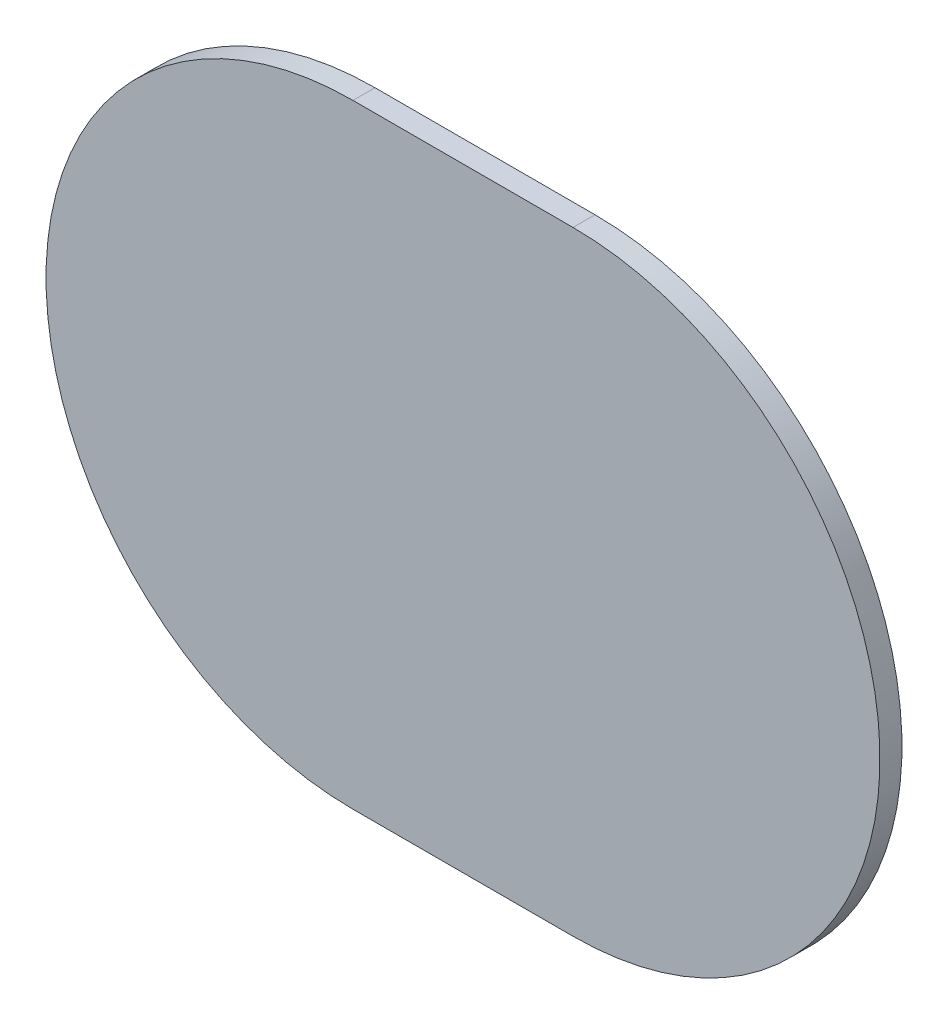
ISO-10303-21;
HEADER;
FILE_DESCRIPTION(('STEP AP214'),'2;1');
FILE_NAME('part.step','',(''),(''),'','','');
FILE_SCHEMA(('AUTOMOTIVE_DESIGN { 1 0 10303 214 1 1 1 1 }'));
ENDSEC;
DATA;
#1=APPLICATION_CONTEXT('core data for automotive mechanical design processes');
#2=APPLICATION_PROTOCOL_DEFINITION('international standard','automotive_design',2000,#1);
#3=PRODUCT_CONTEXT('',#1,'mechanical');
#4=PRODUCT('Part','Part','',(#3));
#5=PRODUCT_RELATED_PRODUCT_CATEGORY('part','',(#4));
#6=PRODUCT_DEFINITION_FORMATION('','',#4);
#7=PRODUCT_DEFINITION_CONTEXT('part definition',#1,'design');
#8=PRODUCT_DEFINITION('design','',#6,#7);
#9=PRODUCT_DEFINITION_SHAPE('','',#8);
#10=(LENGTH_UNIT() NAMED_UNIT(*) SI_UNIT(.MILLI.,.METRE.));
#11=(NAMED_UNIT(*) PLANE_ANGLE_UNIT() SI_UNIT($,.RADIAN.));
#12=(NAMED_UNIT(*) SI_UNIT($,.STERADIAN.) SOLID_ANGLE_UNIT());
#13=UNCERTAINTY_MEASURE_WITH_UNIT(LENGTH_MEASURE(1.E-05),#10,'distance_accuracy_value','');
#14=(GEOMETRIC_REPRESENTATION_CONTEXT(3) GLOBAL_UNCERTAINTY_ASSIGNED_CONTEXT((#13)) GLOBAL_UNIT_ASSIGNED_CONTEXT((#10,
#11,#12)) REPRESENTATION_CONTEXT('',''));
#15=CARTESIAN_POINT('',(0.,0.,0.));
#16=DIRECTION('',(0.,0.,1.));
#17=DIRECTION('',(1.,0.,0.));
#18=AXIS2_PLACEMENT_3D('',#15,#16,#17);
#19=CARTESIAN_POINT('',(-20.,-27.9,2.));
#20=DIRECTION('',(0.,1.,0.));
#21=DIRECTION('',(0.,0.,1.));
#22=AXIS2_PLACEMENT_3D('',#19,#20,#21);
#23=PLANE('',#22);
#24=DIRECTION('',(1.,0.,0.));
#25=VECTOR('',#24,1.);
#26=CARTESIAN_POINT('',(-20.,-27.9,0.));
#27=LINE('',#26,#25);
#28=CARTESIAN_POINT('',(-20.,-27.9,0.));
#29=VERTEX_POINT('',#28);
#30=CARTESIAN_POINT('',(0.,-27.9,0.));
#31=VERTEX_POINT('',#30);
#32=EDGE_CURVE('E102',#29,#31,#27,.T.);
#33=ORIENTED_EDGE('',*,*,#32,.T.);
#34=DIRECTION('',(0.,0.,-1.));
#35=VECTOR('',#34,1.);
#36=CARTESIAN_POINT('',(0.,-27.9,2.));
#37=LINE('',#36,#35);
#38=CARTESIAN_POINT('',(0.,-27.9,2.));
#39=VERTEX_POINT('',#38);
#40=EDGE_CURVE('E11',#39,#31,#37,.T.);
#41=ORIENTED_EDGE('',*,*,#40,.F.);
#42=DIRECTION('',(1.,0.,0.));
#43=VECTOR('',#42,1.);
#44=CARTESIAN_POINT('',(-20.,-27.9,2.));
#45=LINE('',#44,#43);
#46=CARTESIAN_POINT('',(-20.,-27.9,2.));
#47=VERTEX_POINT('',#46);
#48=EDGE_CURVE('E90',#47,#39,#45,.T.);
#49=ORIENTED_EDGE('',*,*,#48,.F.);
#50=DIRECTION('',(0.,0.,-1.));
#51=VECTOR('',#50,1.);
#52=CARTESIAN_POINT('',(-20.,-27.9,2.));
#53=LINE('',#52,#51);
#54=EDGE_CURVE('E98',#47,#29,#53,.T.);
#55=ORIENTED_EDGE('',*,*,#54,.T.);
#56=EDGE_LOOP('',(#33,#41,#49,#55));
#57=FACE_BOUND('',#56,.T.);
#58=ADVANCED_FACE('F39',(#57),#23,.F.);
#59=CARTESIAN_POINT('',(0.,0.,2.));
#60=DIRECTION('',(0.,0.,-1.));
#61=DIRECTION('',(-1.,0.,0.));
#62=AXIS2_PLACEMENT_3D('',#59,#60,#61);
#63=CYLINDRICAL_SURFACE('',#62,27.9);
#64=CARTESIAN_POINT('',(0.,0.,0.));
#65=DIRECTION('',(0.,0.,1.));
#66=DIRECTION('',(1.,0.,0.));
#67=AXIS2_PLACEMENT_3D('',#64,#65,#66);
#68=CIRCLE('',#67,27.9);
#69=CARTESIAN_POINT('',(0.,27.9,0.));
#70=VERTEX_POINT('',#69);
#71=EDGE_CURVE('E94',#31,#70,#68,.T.);
#72=ORIENTED_EDGE('',*,*,#71,.T.);
#73=DIRECTION('',(0.,0.,-1.));
#74=VECTOR('',#73,1.);
#75=CARTESIAN_POINT('',(0.,27.9,2.));
#76=LINE('',#75,#74);
#77=CARTESIAN_POINT('',(0.,27.9,2.));
#78=VERTEX_POINT('',#77);
#79=EDGE_CURVE('E47',#78,#70,#76,.T.);
#80=ORIENTED_EDGE('',*,*,#79,.F.);
#81=CARTESIAN_POINT('',(0.,0.,2.));
#82=DIRECTION('',(0.,0.,1.));
#83=DIRECTION('',(1.,0.,0.));
#84=AXIS2_PLACEMENT_3D('',#81,#82,#83);
#85=CIRCLE('',#84,27.9);
#86=EDGE_CURVE('E85',#39,#78,#85,.T.);
#87=ORIENTED_EDGE('',*,*,#86,.F.);
#88=ORIENTED_EDGE('',*,*,#40,.T.);
#89=EDGE_LOOP('',(#72,#80,#87,#88));
#90=FACE_BOUND('',#89,.T.);
#91=ADVANCED_FACE('F93',(#90),#63,.T.);
#92=CARTESIAN_POINT('',(0.,27.9,2.));
#93=DIRECTION('',(0.,-1.,0.));
#94=DIRECTION('',(0.,0.,-1.));
#95=AXIS2_PLACEMENT_3D('',#92,#93,#94);
#96=PLANE('',#95);
#97=DIRECTION('',(-1.,0.,0.));
#98=VECTOR('',#97,1.);
#99=CARTESIAN_POINT('',(0.,27.9,0.));
#100=LINE('',#99,#98);
#101=CARTESIAN_POINT('',(-20.,27.9,0.));
#102=VERTEX_POINT('',#101);
#103=EDGE_CURVE('E72',#70,#102,#100,.T.);
#104=ORIENTED_EDGE('',*,*,#103,.T.);
#105=DIRECTION('',(0.,0.,-1.));
#106=VECTOR('',#105,1.);
#107=CARTESIAN_POINT('',(-20.,27.9,2.));
#108=LINE('',#107,#106);
#109=CARTESIAN_POINT('',(-20.,27.9,2.));
#110=VERTEX_POINT('',#109);
#111=EDGE_CURVE('E95',#110,#102,#108,.T.);
#112=ORIENTED_EDGE('',*,*,#111,.F.);
#113=DIRECTION('',(-1.,0.,0.));
#114=VECTOR('',#113,1.);
#115=CARTESIAN_POINT('',(0.,27.9,2.));
#116=LINE('',#115,#114);
#117=EDGE_CURVE('E88',#78,#110,#116,.T.);
#118=ORIENTED_EDGE('',*,*,#117,.F.);
#119=ORIENTED_EDGE('',*,*,#79,.T.);
#120=EDGE_LOOP('',(#104,#112,#118,#119));
#121=FACE_BOUND('',#120,.T.);
#122=ADVANCED_FACE('F96',(#121),#96,.F.);
#123=CARTESIAN_POINT('',(-20.,0.,2.));
#124=DIRECTION('',(0.,0.,-1.));
#125=DIRECTION('',(-1.,0.,0.));
#126=AXIS2_PLACEMENT_3D('',#123,#124,#125);
#127=CYLINDRICAL_SURFACE('',#126,27.9);
#128=CARTESIAN_POINT('',(-20.,0.,0.));
#129=DIRECTION('',(0.,0.,1.));
#130=DIRECTION('',(1.,0.,0.));
#131=AXIS2_PLACEMENT_3D('',#128,#129,#130);
#132=CIRCLE('',#131,27.9);
#133=EDGE_CURVE('E78',#102,#29,#132,.T.);
#134=ORIENTED_EDGE('',*,*,#133,.T.);
#135=ORIENTED_EDGE('',*,*,#54,.F.);
#136=CARTESIAN_POINT('',(-20.,0.,2.));
#137=DIRECTION('',(0.,0.,1.));
#138=DIRECTION('',(1.,0.,0.));
#139=AXIS2_PLACEMENT_3D('',#136,#137,#138);
#140=CIRCLE('',#139,27.9);
#141=EDGE_CURVE('E55',#110,#47,#140,.T.);
#142=ORIENTED_EDGE('',*,*,#141,.F.);
#143=ORIENTED_EDGE('',*,*,#111,.T.);
#144=EDGE_LOOP('',(#134,#135,#142,#143));
#145=FACE_BOUND('',#144,.T.);
#146=ADVANCED_FACE('F109',(#145),#127,.T.);
#147=CARTESIAN_POINT('',(0.,0.,2.));
#148=DIRECTION('',(0.,0.,1.));
#149=DIRECTION('',(1.,0.,0.));
#150=AXIS2_PLACEMENT_3D('',#147,#148,#149);
#151=PLANE('',#150);
#152=ORIENTED_EDGE('',*,*,#48,.T.);
#153=ORIENTED_EDGE('',*,*,#86,.T.);
#154=ORIENTED_EDGE('',*,*,#117,.T.);
#155=ORIENTED_EDGE('',*,*,#141,.T.);
#156=EDGE_LOOP('',(#152,#153,#154,#155));
#157=FACE_BOUND('',#156,.T.);
#158=ADVANCED_FACE('F86',(#157),#151,.T.);
#159=CARTESIAN_POINT('',(0.,0.,0.));
#160=DIRECTION('',(0.,0.,1.));
#161=DIRECTION('',(1.,0.,0.));
#162=AXIS2_PLACEMENT_3D('',#159,#160,#161);
#163=PLANE('',#162);
#164=ORIENTED_EDGE('',*,*,#32,.F.);
#165=ORIENTED_EDGE('',*,*,#133,.F.);
#166=ORIENTED_EDGE('',*,*,#103,.F.);
#167=ORIENTED_EDGE('',*,*,#71,.F.);
#168=EDGE_LOOP('',(#164,#165,#166,#167));
#169=FACE_BOUND('',#168,.T.);
#170=ADVANCED_FACE('F112',(#169),#163,.F.);
#171=CLOSED_SHELL('',(#58,#91,#122,#146,#158,#170));
#172=MANIFOLD_SOLID_BREP('B2',#171);
#173=ADVANCED_BREP_SHAPE_REPRESENTATION('',(#18,#172),#14);
#174=SHAPE_DEFINITION_REPRESENTATION(#9,#173);
ENDSEC;
END-ISO-10303-21;
